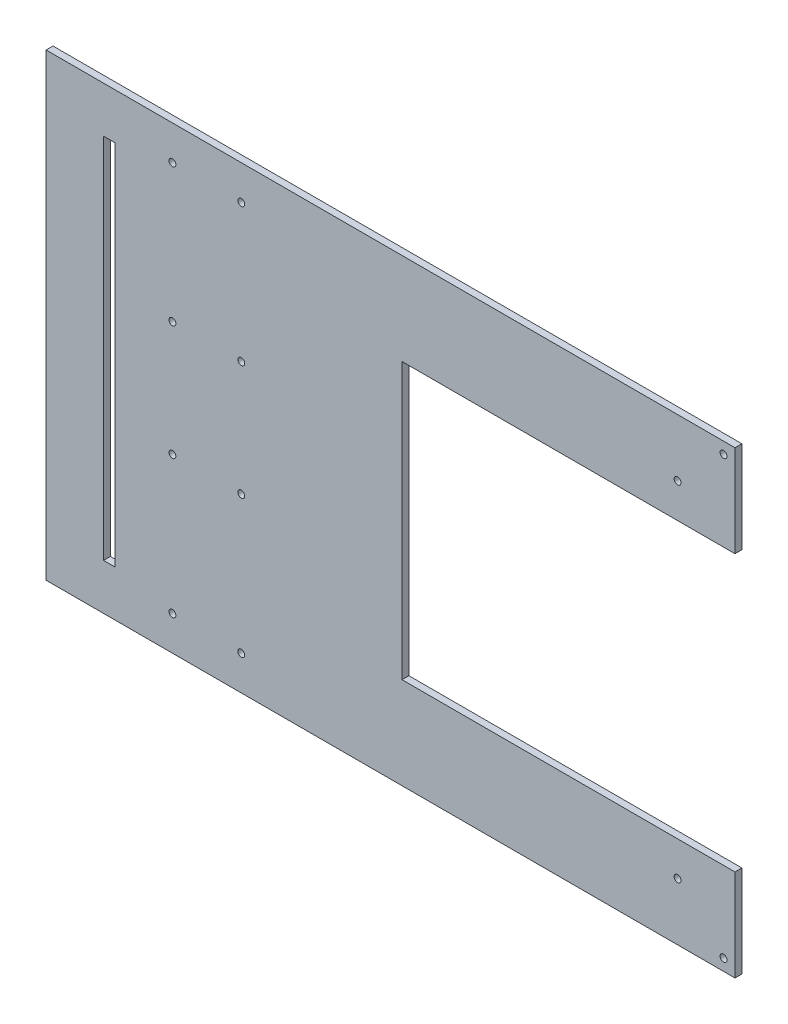
ISO-10303-21;
HEADER;
FILE_DESCRIPTION(('STEP AP214'),'2;1');
FILE_NAME('part.step','',(''),(''),'','','');
FILE_SCHEMA(('AUTOMOTIVE_DESIGN { 1 0 10303 214 1 1 1 1 }'));
ENDSEC;
DATA;
#1=APPLICATION_CONTEXT('core data for automotive mechanical design processes');
#2=APPLICATION_PROTOCOL_DEFINITION('international standard','automotive_design',2000,#1);
#3=PRODUCT_CONTEXT('',#1,'mechanical');
#4=PRODUCT('Part','Part','',(#3));
#5=PRODUCT_RELATED_PRODUCT_CATEGORY('part','',(#4));
#6=PRODUCT_DEFINITION_FORMATION('','',#4);
#7=PRODUCT_DEFINITION_CONTEXT('part definition',#1,'design');
#8=PRODUCT_DEFINITION('design','',#6,#7);
#9=PRODUCT_DEFINITION_SHAPE('','',#8);
#10=(LENGTH_UNIT() NAMED_UNIT(*) SI_UNIT(.MILLI.,.METRE.));
#11=(NAMED_UNIT(*) PLANE_ANGLE_UNIT() SI_UNIT($,.RADIAN.));
#12=(NAMED_UNIT(*) SI_UNIT($,.STERADIAN.) SOLID_ANGLE_UNIT());
#13=UNCERTAINTY_MEASURE_WITH_UNIT(LENGTH_MEASURE(1.E-05),#10,'distance_accuracy_value','');
#14=(GEOMETRIC_REPRESENTATION_CONTEXT(3) GLOBAL_UNCERTAINTY_ASSIGNED_CONTEXT((#13)) GLOBAL_UNIT_ASSIGNED_CONTEXT((#10,
#11,#12)) REPRESENTATION_CONTEXT('',''));
#15=CARTESIAN_POINT('',(0.,0.,0.));
#16=DIRECTION('',(0.,0.,1.));
#17=DIRECTION('',(1.,0.,0.));
#18=AXIS2_PLACEMENT_3D('',#15,#16,#17);
#19=CARTESIAN_POINT('',(0.,0.,3.));
#20=DIRECTION('',(0.,0.,-1.));
#21=DIRECTION('',(-1.,0.,0.));
#22=AXIS2_PLACEMENT_3D('',#19,#20,#21);
#23=PLANE('',#22);
#24=CARTESIAN_POINT('',(85.,75.,3.00000000000006));
#25=DIRECTION('',(0.,0.,-1.));
#26=DIRECTION('',(-1.,0.,0.));
#27=AXIS2_PLACEMENT_3D('',#24,#25,#26);
#28=CIRCLE('',#27,1.5);
#29=CARTESIAN_POINT('',(83.5,75.,3.00000000000006));
#30=VERTEX_POINT('',#29);
#31=EDGE_CURVE('E496',#30,#30,#28,.T.);
#32=ORIENTED_EDGE('',*,*,#31,.T.);
#33=EDGE_LOOP('',(#32));
#34=FACE_BOUND('',#33,.T.);
#35=CARTESIAN_POINT('',(55.,75.,3.00000000000006));
#36=DIRECTION('',(0.,0.,-1.));
#37=DIRECTION('',(-1.,0.,0.));
#38=AXIS2_PLACEMENT_3D('',#35,#36,#37);
#39=CIRCLE('',#38,1.5);
#40=CARTESIAN_POINT('',(53.5,75.,3.00000000000006));
#41=VERTEX_POINT('',#40);
#42=EDGE_CURVE('E490',#41,#41,#39,.T.);
#43=ORIENTED_EDGE('',*,*,#42,.T.);
#44=EDGE_LOOP('',(#43));
#45=FACE_BOUND('',#44,.T.);
#46=CARTESIAN_POINT('',(55.,15.,3.00000000000006));
#47=DIRECTION('',(0.,0.,-1.));
#48=DIRECTION('',(-1.,0.,0.));
#49=AXIS2_PLACEMENT_3D('',#46,#47,#48);
#50=CIRCLE('',#49,1.5);
#51=CARTESIAN_POINT('',(53.5,15.,3.00000000000006));
#52=VERTEX_POINT('',#51);
#53=EDGE_CURVE('E484',#52,#52,#50,.T.);
#54=ORIENTED_EDGE('',*,*,#53,.T.);
#55=EDGE_LOOP('',(#54));
#56=FACE_BOUND('',#55,.T.);
#57=CARTESIAN_POINT('',(85.,15.,3.00000000000006));
#58=DIRECTION('',(0.,0.,-1.));
#59=DIRECTION('',(-1.,0.,0.));
#60=AXIS2_PLACEMENT_3D('',#57,#58,#59);
#61=CIRCLE('',#60,1.5);
#62=CARTESIAN_POINT('',(83.5,15.,3.00000000000006));
#63=VERTEX_POINT('',#62);
#64=EDGE_CURVE('E478',#63,#63,#61,.T.);
#65=ORIENTED_EDGE('',*,*,#64,.T.);
#66=EDGE_LOOP('',(#65));
#67=FACE_BOUND('',#66,.T.);
#68=CARTESIAN_POINT('',(295.,5.,3.00000000000006));
#69=DIRECTION('',(0.,0.,-1.));
#70=DIRECTION('',(-1.,0.,0.));
#71=AXIS2_PLACEMENT_3D('',#68,#69,#70);
#72=CIRCLE('',#71,1.5);
#73=CARTESIAN_POINT('',(293.5,5.,3.00000000000006));
#74=VERTEX_POINT('',#73);
#75=EDGE_CURVE('E472',#74,#74,#72,.T.);
#76=ORIENTED_EDGE('',*,*,#75,.T.);
#77=EDGE_LOOP('',(#76));
#78=FACE_BOUND('',#77,.T.);
#79=CARTESIAN_POINT('',(275.,25.,3.00000000000006));
#80=DIRECTION('',(0.,0.,-1.));
#81=DIRECTION('',(-1.,0.,0.));
#82=AXIS2_PLACEMENT_3D('',#79,#80,#81);
#83=CIRCLE('',#82,1.5);
#84=CARTESIAN_POINT('',(273.5,25.,3.00000000000006));
#85=VERTEX_POINT('',#84);
#86=EDGE_CURVE('E466',#85,#85,#83,.T.);
#87=ORIENTED_EDGE('',*,*,#86,.T.);
#88=EDGE_LOOP('',(#87));
#89=FACE_BOUND('',#88,.T.);
#90=CARTESIAN_POINT('',(85.,185.,3.00000000000006));
#91=DIRECTION('',(0.,0.,-1.));
#92=DIRECTION('',(-1.,0.,0.));
#93=AXIS2_PLACEMENT_3D('',#90,#91,#92);
#94=CIRCLE('',#93,1.5);
#95=CARTESIAN_POINT('',(83.5,185.,3.00000000000006));
#96=VERTEX_POINT('',#95);
#97=EDGE_CURVE('E460',#96,#96,#94,.T.);
#98=ORIENTED_EDGE('',*,*,#97,.T.);
#99=EDGE_LOOP('',(#98));
#100=FACE_BOUND('',#99,.T.);
#101=CARTESIAN_POINT('',(55.,185.,3.00000000000006));
#102=DIRECTION('',(0.,0.,-1.));
#103=DIRECTION('',(-1.,0.,0.));
#104=AXIS2_PLACEMENT_3D('',#101,#102,#103);
#105=CIRCLE('',#104,1.5);
#106=CARTESIAN_POINT('',(53.5,185.,3.00000000000006));
#107=VERTEX_POINT('',#106);
#108=EDGE_CURVE('E454',#107,#107,#105,.T.);
#109=ORIENTED_EDGE('',*,*,#108,.T.);
#110=EDGE_LOOP('',(#109));
#111=FACE_BOUND('',#110,.T.);
#112=CARTESIAN_POINT('',(55.,125.,3.00000000000006));
#113=DIRECTION('',(0.,0.,-1.));
#114=DIRECTION('',(-1.,0.,0.));
#115=AXIS2_PLACEMENT_3D('',#112,#113,#114);
#116=CIRCLE('',#115,1.5);
#117=CARTESIAN_POINT('',(53.5,125.,3.00000000000006));
#118=VERTEX_POINT('',#117);
#119=EDGE_CURVE('E448',#118,#118,#116,.T.);
#120=ORIENTED_EDGE('',*,*,#119,.T.);
#121=EDGE_LOOP('',(#120));
#122=FACE_BOUND('',#121,.T.);
#123=CARTESIAN_POINT('',(85.,125.,3.00000000000006));
#124=DIRECTION('',(0.,0.,-1.));
#125=DIRECTION('',(-1.,0.,0.));
#126=AXIS2_PLACEMENT_3D('',#123,#124,#125);
#127=CIRCLE('',#126,1.5);
#128=CARTESIAN_POINT('',(83.5,125.,3.00000000000006));
#129=VERTEX_POINT('',#128);
#130=EDGE_CURVE('E442',#129,#129,#127,.T.);
#131=ORIENTED_EDGE('',*,*,#130,.T.);
#132=EDGE_LOOP('',(#131));
#133=FACE_BOUND('',#132,.T.);
#134=CARTESIAN_POINT('',(275.,175.,3.00000000000006));
#135=DIRECTION('',(0.,0.,-1.));
#136=DIRECTION('',(-1.,0.,0.));
#137=AXIS2_PLACEMENT_3D('',#134,#135,#136);
#138=CIRCLE('',#137,1.5);
#139=CARTESIAN_POINT('',(273.5,175.,3.00000000000006));
#140=VERTEX_POINT('',#139);
#141=EDGE_CURVE('E436',#140,#140,#138,.T.);
#142=ORIENTED_EDGE('',*,*,#141,.T.);
#143=EDGE_LOOP('',(#142));
#144=FACE_BOUND('',#143,.T.);
#145=CARTESIAN_POINT('',(295.,195.,3.00000000000006));
#146=DIRECTION('',(0.,0.,-1.));
#147=DIRECTION('',(-1.,0.,0.));
#148=AXIS2_PLACEMENT_3D('',#145,#146,#147);
#149=CIRCLE('',#148,1.5);
#150=CARTESIAN_POINT('',(293.5,195.,3.00000000000006));
#151=VERTEX_POINT('',#150);
#152=EDGE_CURVE('E144',#151,#151,#149,.T.);
#153=ORIENTED_EDGE('',*,*,#152,.T.);
#154=EDGE_LOOP('',(#153));
#155=FACE_BOUND('',#154,.T.);
#156=DIRECTION('',(1.,0.,0.));
#157=VECTOR('',#156,1.);
#158=CARTESIAN_POINT('',(300.,160.,3.));
#159=LINE('',#158,#157);
#160=CARTESIAN_POINT('',(155.,160.,3.));
#161=VERTEX_POINT('',#160);
#162=CARTESIAN_POINT('',(300.,160.,3.));
#163=VERTEX_POINT('',#162);
#164=EDGE_CURVE('E159',#161,#163,#159,.T.);
#165=ORIENTED_EDGE('',*,*,#164,.T.);
#166=DIRECTION('',(0.,1.,0.));
#167=VECTOR('',#166,1.);
#168=CARTESIAN_POINT('',(300.,0.,3.));
#169=LINE('',#168,#167);
#170=CARTESIAN_POINT('',(300.,200.,3.));
#171=VERTEX_POINT('',#170);
#172=EDGE_CURVE('E190',#163,#171,#169,.T.);
#173=ORIENTED_EDGE('',*,*,#172,.T.);
#174=DIRECTION('',(-1.,0.,0.));
#175=VECTOR('',#174,1.);
#176=CARTESIAN_POINT('',(0.,200.,3.));
#177=LINE('',#176,#175);
#178=CARTESIAN_POINT('',(0.,200.,3.));
#179=VERTEX_POINT('',#178);
#180=EDGE_CURVE('E194',#171,#179,#177,.T.);
#181=ORIENTED_EDGE('',*,*,#180,.T.);
#182=DIRECTION('',(0.,-1.,0.));
#183=VECTOR('',#182,1.);
#184=CARTESIAN_POINT('',(0.,0.,3.));
#185=LINE('',#184,#183);
#186=CARTESIAN_POINT('',(0.,0.,3.));
#187=VERTEX_POINT('',#186);
#188=EDGE_CURVE('E184',#179,#187,#185,.T.);
#189=ORIENTED_EDGE('',*,*,#188,.T.);
#190=DIRECTION('',(1.,0.,0.));
#191=VECTOR('',#190,1.);
#192=CARTESIAN_POINT('',(0.,0.,3.));
#193=LINE('',#192,#191);
#194=CARTESIAN_POINT('',(300.,0.,3.));
#195=VERTEX_POINT('',#194);
#196=EDGE_CURVE('E187',#187,#195,#193,.T.);
#197=ORIENTED_EDGE('',*,*,#196,.T.);
#198=CARTESIAN_POINT('',(300.,40.,3.));
#199=VERTEX_POINT('',#198);
#200=EDGE_CURVE('E191',#195,#199,#169,.T.);
#201=ORIENTED_EDGE('',*,*,#200,.T.);
#202=DIRECTION('',(1.,0.,0.));
#203=VECTOR('',#202,1.);
#204=CARTESIAN_POINT('',(300.,40.,3.));
#205=LINE('',#204,#203);
#206=CARTESIAN_POINT('',(155.,40.,3.00000000000006));
#207=VERTEX_POINT('',#206);
#208=EDGE_CURVE('E163',#207,#199,#205,.T.);
#209=ORIENTED_EDGE('',*,*,#208,.F.);
#210=DIRECTION('',(0.,1.,0.));
#211=VECTOR('',#210,1.);
#212=CARTESIAN_POINT('',(155.,160.,3.));
#213=LINE('',#212,#211);
#214=EDGE_CURVE('E156',#207,#161,#213,.T.);
#215=ORIENTED_EDGE('',*,*,#214,.T.);
#216=EDGE_LOOP('',(#165,#173,#181,#189,#197,#201,#209,#215));
#217=FACE_BOUND('',#216,.T.);
#218=DIRECTION('',(1.,0.,0.));
#219=VECTOR('',#218,1.);
#220=CARTESIAN_POINT('',(25.,180.,3.));
#221=LINE('',#220,#219);
#222=CARTESIAN_POINT('',(25.,180.,3.));
#223=VERTEX_POINT('',#222);
#224=CARTESIAN_POINT('',(30.,180.,3.));
#225=VERTEX_POINT('',#224);
#226=EDGE_CURVE('E152',#223,#225,#221,.T.);
#227=ORIENTED_EDGE('',*,*,#226,.T.);
#228=DIRECTION('',(0.,-1.,0.));
#229=VECTOR('',#228,1.);
#230=CARTESIAN_POINT('',(30.,180.,3.));
#231=LINE('',#230,#229);
#232=CARTESIAN_POINT('',(30.,20.,3.));
#233=VERTEX_POINT('',#232);
#234=EDGE_CURVE('E155',#225,#233,#231,.T.);
#235=ORIENTED_EDGE('',*,*,#234,.T.);
#236=DIRECTION('',(-1.,0.,0.));
#237=VECTOR('',#236,1.);
#238=CARTESIAN_POINT('',(25.,20.,3.));
#239=LINE('',#238,#237);
#240=CARTESIAN_POINT('',(25.,20.,3.));
#241=VERTEX_POINT('',#240);
#242=EDGE_CURVE('E125',#233,#241,#239,.T.);
#243=ORIENTED_EDGE('',*,*,#242,.T.);
#244=DIRECTION('',(0.,1.,0.));
#245=VECTOR('',#244,1.);
#246=CARTESIAN_POINT('',(25.,180.,3.));
#247=LINE('',#246,#245);
#248=EDGE_CURVE('E168',#241,#223,#247,.T.);
#249=ORIENTED_EDGE('',*,*,#248,.T.);
#250=EDGE_LOOP('',(#227,#235,#243,#249));
#251=FACE_BOUND('',#250,.T.);
#252=ADVANCED_FACE('F33',(#34,#45,#56,#67,#78,#89,#100,#111,#122,#133,#144,#155,#217,#251),#23,.F.);
#253=CARTESIAN_POINT('',(0.,0.,0.));
#254=DIRECTION('',(0.,0.,-1.));
#255=DIRECTION('',(-1.,0.,0.));
#256=AXIS2_PLACEMENT_3D('',#253,#254,#255);
#257=PLANE('',#256);
#258=CARTESIAN_POINT('',(85.,75.,0.));
#259=DIRECTION('',(0.,0.,-1.));
#260=DIRECTION('',(-1.,0.,0.));
#261=AXIS2_PLACEMENT_3D('',#258,#259,#260);
#262=CIRCLE('',#261,1.5);
#263=CARTESIAN_POINT('',(83.5,75.,0.));
#264=VERTEX_POINT('',#263);
#265=EDGE_CURVE('E498',#264,#264,#262,.T.);
#266=ORIENTED_EDGE('',*,*,#265,.F.);
#267=EDGE_LOOP('',(#266));
#268=FACE_BOUND('',#267,.T.);
#269=CARTESIAN_POINT('',(55.,75.,0.));
#270=DIRECTION('',(0.,0.,-1.));
#271=DIRECTION('',(-1.,0.,0.));
#272=AXIS2_PLACEMENT_3D('',#269,#270,#271);
#273=CIRCLE('',#272,1.5);
#274=CARTESIAN_POINT('',(53.5,75.,0.));
#275=VERTEX_POINT('',#274);
#276=EDGE_CURVE('E493',#275,#275,#273,.T.);
#277=ORIENTED_EDGE('',*,*,#276,.F.);
#278=EDGE_LOOP('',(#277));
#279=FACE_BOUND('',#278,.T.);
#280=CARTESIAN_POINT('',(55.,15.,0.));
#281=DIRECTION('',(0.,0.,-1.));
#282=DIRECTION('',(-1.,0.,0.));
#283=AXIS2_PLACEMENT_3D('',#280,#281,#282);
#284=CIRCLE('',#283,1.5);
#285=CARTESIAN_POINT('',(53.5,15.,0.));
#286=VERTEX_POINT('',#285);
#287=EDGE_CURVE('E487',#286,#286,#284,.T.);
#288=ORIENTED_EDGE('',*,*,#287,.F.);
#289=EDGE_LOOP('',(#288));
#290=FACE_BOUND('',#289,.T.);
#291=CARTESIAN_POINT('',(85.,15.,0.));
#292=DIRECTION('',(0.,0.,-1.));
#293=DIRECTION('',(-1.,0.,0.));
#294=AXIS2_PLACEMENT_3D('',#291,#292,#293);
#295=CIRCLE('',#294,1.5);
#296=CARTESIAN_POINT('',(83.5,15.,0.));
#297=VERTEX_POINT('',#296);
#298=EDGE_CURVE('E481',#297,#297,#295,.T.);
#299=ORIENTED_EDGE('',*,*,#298,.F.);
#300=EDGE_LOOP('',(#299));
#301=FACE_BOUND('',#300,.T.);
#302=CARTESIAN_POINT('',(295.,5.,0.));
#303=DIRECTION('',(0.,0.,-1.));
#304=DIRECTION('',(-1.,0.,0.));
#305=AXIS2_PLACEMENT_3D('',#302,#303,#304);
#306=CIRCLE('',#305,1.5);
#307=CARTESIAN_POINT('',(293.5,5.,0.));
#308=VERTEX_POINT('',#307);
#309=EDGE_CURVE('E475',#308,#308,#306,.T.);
#310=ORIENTED_EDGE('',*,*,#309,.F.);
#311=EDGE_LOOP('',(#310));
#312=FACE_BOUND('',#311,.T.);
#313=CARTESIAN_POINT('',(275.,25.,0.));
#314=DIRECTION('',(0.,0.,-1.));
#315=DIRECTION('',(-1.,0.,0.));
#316=AXIS2_PLACEMENT_3D('',#313,#314,#315);
#317=CIRCLE('',#316,1.5);
#318=CARTESIAN_POINT('',(273.5,25.,0.));
#319=VERTEX_POINT('',#318);
#320=EDGE_CURVE('E469',#319,#319,#317,.T.);
#321=ORIENTED_EDGE('',*,*,#320,.F.);
#322=EDGE_LOOP('',(#321));
#323=FACE_BOUND('',#322,.T.);
#324=CARTESIAN_POINT('',(85.,185.,0.));
#325=DIRECTION('',(0.,0.,-1.));
#326=DIRECTION('',(-1.,0.,0.));
#327=AXIS2_PLACEMENT_3D('',#324,#325,#326);
#328=CIRCLE('',#327,1.5);
#329=CARTESIAN_POINT('',(83.5,185.,0.));
#330=VERTEX_POINT('',#329);
#331=EDGE_CURVE('E463',#330,#330,#328,.T.);
#332=ORIENTED_EDGE('',*,*,#331,.F.);
#333=EDGE_LOOP('',(#332));
#334=FACE_BOUND('',#333,.T.);
#335=CARTESIAN_POINT('',(55.,185.,0.));
#336=DIRECTION('',(0.,0.,-1.));
#337=DIRECTION('',(-1.,0.,0.));
#338=AXIS2_PLACEMENT_3D('',#335,#336,#337);
#339=CIRCLE('',#338,1.5);
#340=CARTESIAN_POINT('',(53.5,185.,0.));
#341=VERTEX_POINT('',#340);
#342=EDGE_CURVE('E457',#341,#341,#339,.T.);
#343=ORIENTED_EDGE('',*,*,#342,.F.);
#344=EDGE_LOOP('',(#343));
#345=FACE_BOUND('',#344,.T.);
#346=CARTESIAN_POINT('',(55.,125.,0.));
#347=DIRECTION('',(0.,0.,-1.));
#348=DIRECTION('',(-1.,0.,0.));
#349=AXIS2_PLACEMENT_3D('',#346,#347,#348);
#350=CIRCLE('',#349,1.5);
#351=CARTESIAN_POINT('',(53.5,125.,0.));
#352=VERTEX_POINT('',#351);
#353=EDGE_CURVE('E451',#352,#352,#350,.T.);
#354=ORIENTED_EDGE('',*,*,#353,.F.);
#355=EDGE_LOOP('',(#354));
#356=FACE_BOUND('',#355,.T.);
#357=CARTESIAN_POINT('',(85.,125.,0.));
#358=DIRECTION('',(0.,0.,-1.));
#359=DIRECTION('',(-1.,0.,0.));
#360=AXIS2_PLACEMENT_3D('',#357,#358,#359);
#361=CIRCLE('',#360,1.5);
#362=CARTESIAN_POINT('',(83.5,125.,0.));
#363=VERTEX_POINT('',#362);
#364=EDGE_CURVE('E445',#363,#363,#361,.T.);
#365=ORIENTED_EDGE('',*,*,#364,.F.);
#366=EDGE_LOOP('',(#365));
#367=FACE_BOUND('',#366,.T.);
#368=CARTESIAN_POINT('',(275.,175.,0.));
#369=DIRECTION('',(0.,0.,-1.));
#370=DIRECTION('',(-1.,0.,0.));
#371=AXIS2_PLACEMENT_3D('',#368,#369,#370);
#372=CIRCLE('',#371,1.5);
#373=CARTESIAN_POINT('',(273.5,175.,0.));
#374=VERTEX_POINT('',#373);
#375=EDGE_CURVE('E439',#374,#374,#372,.T.);
#376=ORIENTED_EDGE('',*,*,#375,.F.);
#377=EDGE_LOOP('',(#376));
#378=FACE_BOUND('',#377,.T.);
#379=CARTESIAN_POINT('',(295.,195.,0.));
#380=DIRECTION('',(0.,0.,-1.));
#381=DIRECTION('',(-1.,0.,0.));
#382=AXIS2_PLACEMENT_3D('',#379,#380,#381);
#383=CIRCLE('',#382,1.5);
#384=CARTESIAN_POINT('',(293.5,195.,0.));
#385=VERTEX_POINT('',#384);
#386=EDGE_CURVE('E433',#385,#385,#383,.T.);
#387=ORIENTED_EDGE('',*,*,#386,.F.);
#388=EDGE_LOOP('',(#387));
#389=FACE_BOUND('',#388,.T.);
#390=DIRECTION('',(0.,1.,0.));
#391=VECTOR('',#390,1.);
#392=CARTESIAN_POINT('',(300.,0.,0.));
#393=LINE('',#392,#391);
#394=CARTESIAN_POINT('',(300.,160.,0.));
#395=VERTEX_POINT('',#394);
#396=CARTESIAN_POINT('',(300.,200.,0.));
#397=VERTEX_POINT('',#396);
#398=EDGE_CURVE('E201',#395,#397,#393,.T.);
#399=ORIENTED_EDGE('',*,*,#398,.F.);
#400=DIRECTION('',(-1.,0.,0.));
#401=VECTOR('',#400,1.);
#402=CARTESIAN_POINT('',(300.,160.,0.));
#403=LINE('',#402,#401);
#404=CARTESIAN_POINT('',(155.,160.,0.));
#405=VERTEX_POINT('',#404);
#406=EDGE_CURVE('E171',#395,#405,#403,.T.);
#407=ORIENTED_EDGE('',*,*,#406,.T.);
#408=DIRECTION('',(0.,-1.,0.));
#409=VECTOR('',#408,1.);
#410=CARTESIAN_POINT('',(155.,160.,0.));
#411=LINE('',#410,#409);
#412=CARTESIAN_POINT('',(155.,40.,0.));
#413=VERTEX_POINT('',#412);
#414=EDGE_CURVE('E167',#405,#413,#411,.T.);
#415=ORIENTED_EDGE('',*,*,#414,.T.);
#416=DIRECTION('',(-1.,0.,0.));
#417=VECTOR('',#416,1.);
#418=CARTESIAN_POINT('',(300.,40.,0.));
#419=LINE('',#418,#417);
#420=CARTESIAN_POINT('',(300.,40.,0.));
#421=VERTEX_POINT('',#420);
#422=EDGE_CURVE('E164',#421,#413,#419,.T.);
#423=ORIENTED_EDGE('',*,*,#422,.F.);
#424=CARTESIAN_POINT('',(300.,0.,0.));
#425=VERTEX_POINT('',#424);
#426=EDGE_CURVE('E202',#425,#421,#393,.T.);
#427=ORIENTED_EDGE('',*,*,#426,.F.);
#428=DIRECTION('',(1.,0.,0.));
#429=VECTOR('',#428,1.);
#430=CARTESIAN_POINT('',(0.,0.,0.));
#431=LINE('',#430,#429);
#432=CARTESIAN_POINT('',(0.,0.,0.));
#433=VERTEX_POINT('',#432);
#434=EDGE_CURVE('E199',#433,#425,#431,.T.);
#435=ORIENTED_EDGE('',*,*,#434,.F.);
#436=DIRECTION('',(0.,-1.,0.));
#437=VECTOR('',#436,1.);
#438=CARTESIAN_POINT('',(0.,0.,0.));
#439=LINE('',#438,#437);
#440=CARTESIAN_POINT('',(0.,200.,0.));
#441=VERTEX_POINT('',#440);
#442=EDGE_CURVE('E183',#441,#433,#439,.T.);
#443=ORIENTED_EDGE('',*,*,#442,.F.);
#444=DIRECTION('',(-1.,0.,0.));
#445=VECTOR('',#444,1.);
#446=CARTESIAN_POINT('',(0.,200.,0.));
#447=LINE('',#446,#445);
#448=EDGE_CURVE('E188',#397,#441,#447,.T.);
#449=ORIENTED_EDGE('',*,*,#448,.F.);
#450=EDGE_LOOP('',(#399,#407,#415,#423,#427,#435,#443,#449));
#451=FACE_BOUND('',#450,.T.);
#452=DIRECTION('',(0.,1.,0.));
#453=VECTOR('',#452,1.);
#454=CARTESIAN_POINT('',(30.,180.,0.));
#455=LINE('',#454,#453);
#456=CARTESIAN_POINT('',(30.,20.,0.));
#457=VERTEX_POINT('',#456);
#458=CARTESIAN_POINT('',(30.,180.,0.));
#459=VERTEX_POINT('',#458);
#460=EDGE_CURVE('E132',#457,#459,#455,.T.);
#461=ORIENTED_EDGE('',*,*,#460,.T.);
#462=DIRECTION('',(-1.,0.,0.));
#463=VECTOR('',#462,1.);
#464=CARTESIAN_POINT('',(25.,180.,0.));
#465=LINE('',#464,#463);
#466=CARTESIAN_POINT('',(25.,180.,0.));
#467=VERTEX_POINT('',#466);
#468=EDGE_CURVE('E138',#459,#467,#465,.T.);
#469=ORIENTED_EDGE('',*,*,#468,.T.);
#470=DIRECTION('',(0.,-1.,0.));
#471=VECTOR('',#470,1.);
#472=CARTESIAN_POINT('',(25.,180.,0.));
#473=LINE('',#472,#471);
#474=CARTESIAN_POINT('',(25.,20.,0.));
#475=VERTEX_POINT('',#474);
#476=EDGE_CURVE('E142',#467,#475,#473,.T.);
#477=ORIENTED_EDGE('',*,*,#476,.T.);
#478=DIRECTION('',(1.,0.,0.));
#479=VECTOR('',#478,1.);
#480=CARTESIAN_POINT('',(25.,20.,0.));
#481=LINE('',#480,#479);
#482=EDGE_CURVE('E56',#475,#457,#481,.T.);
#483=ORIENTED_EDGE('',*,*,#482,.T.);
#484=EDGE_LOOP('',(#461,#469,#477,#483));
#485=FACE_BOUND('',#484,.T.);
#486=ADVANCED_FACE('F141',(#268,#279,#290,#301,#312,#323,#334,#345,#356,#367,#378,#389,#451,
#485),#257,.T.);
#487=CARTESIAN_POINT('',(300.,0.,3.));
#488=DIRECTION('',(-1.,0.,0.));
#489=DIRECTION('',(0.,0.,1.));
#490=AXIS2_PLACEMENT_3D('',#487,#488,#489);
#491=PLANE('',#490);
#492=DIRECTION('',(0.,0.,-1.));
#493=VECTOR('',#492,1.);
#494=CARTESIAN_POINT('',(300.,160.,191.215302247187));
#495=LINE('',#494,#493);
#496=EDGE_CURVE('E160',#163,#395,#495,.T.);
#497=ORIENTED_EDGE('',*,*,#496,.T.);
#498=ORIENTED_EDGE('',*,*,#398,.T.);
#499=DIRECTION('',(0.,0.,-1.));
#500=VECTOR('',#499,1.);
#501=CARTESIAN_POINT('',(300.,200.,3.));
#502=LINE('',#501,#500);
#503=EDGE_CURVE('E208',#171,#397,#502,.T.);
#504=ORIENTED_EDGE('',*,*,#503,.F.);
#505=ORIENTED_EDGE('',*,*,#172,.F.);
#506=EDGE_LOOP('',(#497,#498,#504,#505));
#507=FACE_BOUND('',#506,.T.);
#508=ADVANCED_FACE('F241',(#507),#491,.F.);
#509=CARTESIAN_POINT('',(0.,0.,3.));
#510=DIRECTION('',(1.,0.,0.));
#511=DIRECTION('',(0.,0.,-1.));
#512=AXIS2_PLACEMENT_3D('',#509,#510,#511);
#513=PLANE('',#512);
#514=ORIENTED_EDGE('',*,*,#442,.T.);
#515=DIRECTION('',(0.,0.,-1.));
#516=VECTOR('',#515,1.);
#517=CARTESIAN_POINT('',(0.,0.,3.));
#518=LINE('',#517,#516);
#519=EDGE_CURVE('E11',#187,#433,#518,.T.);
#520=ORIENTED_EDGE('',*,*,#519,.F.);
#521=ORIENTED_EDGE('',*,*,#188,.F.);
#522=DIRECTION('',(0.,0.,-1.));
#523=VECTOR('',#522,1.);
#524=CARTESIAN_POINT('',(0.,200.,3.));
#525=LINE('',#524,#523);
#526=EDGE_CURVE('E196',#179,#441,#525,.T.);
#527=ORIENTED_EDGE('',*,*,#526,.T.);
#528=EDGE_LOOP('',(#514,#520,#521,#527));
#529=FACE_BOUND('',#528,.T.);
#530=ADVANCED_FACE('F35',(#529),#513,.F.);
#531=CARTESIAN_POINT('',(0.,0.,3.));
#532=DIRECTION('',(0.,1.,0.));
#533=DIRECTION('',(0.,0.,1.));
#534=AXIS2_PLACEMENT_3D('',#531,#532,#533);
#535=PLANE('',#534);
#536=ORIENTED_EDGE('',*,*,#434,.T.);
#537=DIRECTION('',(0.,0.,-1.));
#538=VECTOR('',#537,1.);
#539=CARTESIAN_POINT('',(300.,0.,3.));
#540=LINE('',#539,#538);
#541=EDGE_CURVE('E41',#195,#425,#540,.T.);
#542=ORIENTED_EDGE('',*,*,#541,.F.);
#543=ORIENTED_EDGE('',*,*,#196,.F.);
#544=ORIENTED_EDGE('',*,*,#519,.T.);
#545=EDGE_LOOP('',(#536,#542,#543,#544));
#546=FACE_BOUND('',#545,.T.);
#547=ADVANCED_FACE('F231',(#546),#535,.F.);
#548=ORIENTED_EDGE('',*,*,#426,.T.);
#549=DIRECTION('',(0.,0.,-1.));
#550=VECTOR('',#549,1.);
#551=CARTESIAN_POINT('',(300.,40.,191.215302247187));
#552=LINE('',#551,#550);
#553=EDGE_CURVE('E174',#199,#421,#552,.T.);
#554=ORIENTED_EDGE('',*,*,#553,.F.);
#555=ORIENTED_EDGE('',*,*,#200,.F.);
#556=ORIENTED_EDGE('',*,*,#541,.T.);
#557=EDGE_LOOP('',(#548,#554,#555,#556));
#558=FACE_BOUND('',#557,.T.);
#559=ADVANCED_FACE('F215',(#558),#491,.F.);
#560=CARTESIAN_POINT('',(0.,200.,3.));
#561=DIRECTION('',(0.,-1.,0.));
#562=DIRECTION('',(0.,0.,-1.));
#563=AXIS2_PLACEMENT_3D('',#560,#561,#562);
#564=PLANE('',#563);
#565=ORIENTED_EDGE('',*,*,#448,.T.);
#566=ORIENTED_EDGE('',*,*,#526,.F.);
#567=ORIENTED_EDGE('',*,*,#180,.F.);
#568=ORIENTED_EDGE('',*,*,#503,.T.);
#569=EDGE_LOOP('',(#565,#566,#567,#568));
#570=FACE_BOUND('',#569,.T.);
#571=ADVANCED_FACE('F236',(#570),#564,.F.);
#572=CARTESIAN_POINT('',(300.,160.,191.215302247187));
#573=DIRECTION('',(0.,-1.,0.));
#574=DIRECTION('',(1.,0.,0.));
#575=AXIS2_PLACEMENT_3D('',#572,#573,#574);
#576=PLANE('',#575);
#577=DIRECTION('',(0.,0.,-1.));
#578=VECTOR('',#577,1.);
#579=CARTESIAN_POINT('',(155.,160.,191.215302247187));
#580=LINE('',#579,#578);
#581=EDGE_CURVE('E177',#161,#405,#580,.T.);
#582=ORIENTED_EDGE('',*,*,#581,.T.);
#583=ORIENTED_EDGE('',*,*,#406,.F.);
#584=ORIENTED_EDGE('',*,*,#496,.F.);
#585=ORIENTED_EDGE('',*,*,#164,.F.);
#586=EDGE_LOOP('',(#582,#583,#584,#585));
#587=FACE_BOUND('',#586,.T.);
#588=ADVANCED_FACE('F243',(#587),#576,.T.);
#589=CARTESIAN_POINT('',(155.,160.,191.215302247187));
#590=DIRECTION('',(1.,0.,0.));
#591=DIRECTION('',(0.,1.,0.));
#592=AXIS2_PLACEMENT_3D('',#589,#590,#591);
#593=PLANE('',#592);
#594=DIRECTION('',(0.,0.,-1.));
#595=VECTOR('',#594,1.);
#596=CARTESIAN_POINT('',(155.,40.,191.215302247187));
#597=LINE('',#596,#595);
#598=EDGE_CURVE('E179',#207,#413,#597,.T.);
#599=ORIENTED_EDGE('',*,*,#598,.T.);
#600=ORIENTED_EDGE('',*,*,#414,.F.);
#601=ORIENTED_EDGE('',*,*,#581,.F.);
#602=ORIENTED_EDGE('',*,*,#214,.F.);
#603=EDGE_LOOP('',(#599,#600,#601,#602));
#604=FACE_BOUND('',#603,.T.);
#605=ADVANCED_FACE('F246',(#604),#593,.T.);
#606=CARTESIAN_POINT('',(300.,40.,191.215302247187));
#607=DIRECTION('',(0.,-1.,0.));
#608=DIRECTION('',(1.,0.,0.));
#609=AXIS2_PLACEMENT_3D('',#606,#607,#608);
#610=PLANE('',#609);
#611=ORIENTED_EDGE('',*,*,#208,.T.);
#612=ORIENTED_EDGE('',*,*,#553,.T.);
#613=ORIENTED_EDGE('',*,*,#422,.T.);
#614=ORIENTED_EDGE('',*,*,#598,.F.);
#615=EDGE_LOOP('',(#611,#612,#613,#614));
#616=FACE_BOUND('',#615,.T.);
#617=ADVANCED_FACE('F225',(#616),#610,.F.);
#618=CARTESIAN_POINT('',(25.,180.,163.078105935821));
#619=DIRECTION('',(0.,-1.,0.));
#620=DIRECTION('',(0.,0.,-1.));
#621=AXIS2_PLACEMENT_3D('',#618,#619,#620);
#622=PLANE('',#621);
#623=DIRECTION('',(0.,0.,-1.));
#624=VECTOR('',#623,1.);
#625=CARTESIAN_POINT('',(25.,180.,163.078105935821));
#626=LINE('',#625,#624);
#627=EDGE_CURVE('E48',#223,#467,#626,.T.);
#628=ORIENTED_EDGE('',*,*,#627,.T.);
#629=ORIENTED_EDGE('',*,*,#468,.F.);
#630=DIRECTION('',(0.,0.,-1.));
#631=VECTOR('',#630,1.);
#632=CARTESIAN_POINT('',(30.,180.,163.078105935821));
#633=LINE('',#632,#631);
#634=EDGE_CURVE('E129',#225,#459,#633,.T.);
#635=ORIENTED_EDGE('',*,*,#634,.F.);
#636=ORIENTED_EDGE('',*,*,#226,.F.);
#637=EDGE_LOOP('',(#628,#629,#635,#636));
#638=FACE_BOUND('',#637,.T.);
#639=ADVANCED_FACE('F253',(#638),#622,.T.);
#640=CARTESIAN_POINT('',(30.,180.,163.078105935821));
#641=DIRECTION('',(-1.,0.,0.));
#642=DIRECTION('',(0.,-1.,0.));
#643=AXIS2_PLACEMENT_3D('',#640,#641,#642);
#644=PLANE('',#643);
#645=ORIENTED_EDGE('',*,*,#634,.T.);
#646=ORIENTED_EDGE('',*,*,#460,.F.);
#647=DIRECTION('',(0.,0.,-1.));
#648=VECTOR('',#647,1.);
#649=CARTESIAN_POINT('',(30.,20.,163.078105935821));
#650=LINE('',#649,#648);
#651=EDGE_CURVE('E121',#233,#457,#650,.T.);
#652=ORIENTED_EDGE('',*,*,#651,.F.);
#653=ORIENTED_EDGE('',*,*,#234,.F.);
#654=EDGE_LOOP('',(#645,#646,#652,#653));
#655=FACE_BOUND('',#654,.T.);
#656=ADVANCED_FACE('F133',(#655),#644,.T.);
#657=CARTESIAN_POINT('',(25.,20.,163.078105935821));
#658=DIRECTION('',(0.,1.,0.));
#659=DIRECTION('',(-1.,0.,0.));
#660=AXIS2_PLACEMENT_3D('',#657,#658,#659);
#661=PLANE('',#660);
#662=ORIENTED_EDGE('',*,*,#651,.T.);
#663=ORIENTED_EDGE('',*,*,#482,.F.);
#664=DIRECTION('',(0.,0.,-1.));
#665=VECTOR('',#664,1.);
#666=CARTESIAN_POINT('',(25.,20.,163.078105935821));
#667=LINE('',#666,#665);
#668=EDGE_CURVE('E128',#241,#475,#667,.T.);
#669=ORIENTED_EDGE('',*,*,#668,.F.);
#670=ORIENTED_EDGE('',*,*,#242,.F.);
#671=EDGE_LOOP('',(#662,#663,#669,#670));
#672=FACE_BOUND('',#671,.T.);
#673=ADVANCED_FACE('F123',(#672),#661,.T.);
#674=CARTESIAN_POINT('',(25.,180.,163.078105935821));
#675=DIRECTION('',(1.,0.,0.));
#676=DIRECTION('',(0.,1.,0.));
#677=AXIS2_PLACEMENT_3D('',#674,#675,#676);
#678=PLANE('',#677);
#679=ORIENTED_EDGE('',*,*,#668,.T.);
#680=ORIENTED_EDGE('',*,*,#476,.F.);
#681=ORIENTED_EDGE('',*,*,#627,.F.);
#682=ORIENTED_EDGE('',*,*,#248,.F.);
#683=EDGE_LOOP('',(#679,#680,#681,#682));
#684=FACE_BOUND('',#683,.T.);
#685=ADVANCED_FACE('F300',(#684),#678,.T.);
#686=CARTESIAN_POINT('',(295.,195.,0.));
#687=DIRECTION('',(0.,0.,-1.));
#688=DIRECTION('',(-1.,0.,0.));
#689=AXIS2_PLACEMENT_3D('',#686,#687,#688);
#690=CYLINDRICAL_SURFACE('',#689,1.5);
#691=ORIENTED_EDGE('',*,*,#152,.F.);
#692=EDGE_LOOP('',(#691));
#693=FACE_BOUND('',#692,.T.);
#694=ORIENTED_EDGE('',*,*,#386,.T.);
#695=EDGE_LOOP('',(#694));
#696=FACE_BOUND('',#695,.T.);
#697=ADVANCED_FACE('F294',(#693,#696),#690,.F.);
#698=CARTESIAN_POINT('',(275.,175.,0.));
#699=DIRECTION('',(0.,0.,-1.));
#700=DIRECTION('',(-1.,0.,0.));
#701=AXIS2_PLACEMENT_3D('',#698,#699,#700);
#702=CYLINDRICAL_SURFACE('',#701,1.5);
#703=ORIENTED_EDGE('',*,*,#141,.F.);
#704=EDGE_LOOP('',(#703));
#705=FACE_BOUND('',#704,.T.);
#706=ORIENTED_EDGE('',*,*,#375,.T.);
#707=EDGE_LOOP('',(#706));
#708=FACE_BOUND('',#707,.T.);
#709=ADVANCED_FACE('F299',(#705,#708),#702,.F.);
#710=CARTESIAN_POINT('',(85.,125.,0.));
#711=DIRECTION('',(0.,0.,-1.));
#712=DIRECTION('',(-1.,0.,0.));
#713=AXIS2_PLACEMENT_3D('',#710,#711,#712);
#714=CYLINDRICAL_SURFACE('',#713,1.5);
#715=ORIENTED_EDGE('',*,*,#130,.F.);
#716=EDGE_LOOP('',(#715));
#717=FACE_BOUND('',#716,.T.);
#718=ORIENTED_EDGE('',*,*,#364,.T.);
#719=EDGE_LOOP('',(#718));
#720=FACE_BOUND('',#719,.T.);
#721=ADVANCED_FACE('F312',(#717,#720),#714,.F.);
#722=CARTESIAN_POINT('',(55.,125.,0.));
#723=DIRECTION('',(0.,0.,-1.));
#724=DIRECTION('',(-1.,0.,0.));
#725=AXIS2_PLACEMENT_3D('',#722,#723,#724);
#726=CYLINDRICAL_SURFACE('',#725,1.5);
#727=ORIENTED_EDGE('',*,*,#119,.F.);
#728=EDGE_LOOP('',(#727));
#729=FACE_BOUND('',#728,.T.);
#730=ORIENTED_EDGE('',*,*,#353,.T.);
#731=EDGE_LOOP('',(#730));
#732=FACE_BOUND('',#731,.T.);
#733=ADVANCED_FACE('F322',(#729,#732),#726,.F.);
#734=CARTESIAN_POINT('',(55.,185.,0.));
#735=DIRECTION('',(0.,0.,-1.));
#736=DIRECTION('',(-1.,0.,0.));
#737=AXIS2_PLACEMENT_3D('',#734,#735,#736);
#738=CYLINDRICAL_SURFACE('',#737,1.5);
#739=ORIENTED_EDGE('',*,*,#108,.F.);
#740=EDGE_LOOP('',(#739));
#741=FACE_BOUND('',#740,.T.);
#742=ORIENTED_EDGE('',*,*,#342,.T.);
#743=EDGE_LOOP('',(#742));
#744=FACE_BOUND('',#743,.T.);
#745=ADVANCED_FACE('F332',(#741,#744),#738,.F.);
#746=CARTESIAN_POINT('',(85.,185.,0.));
#747=DIRECTION('',(0.,0.,-1.));
#748=DIRECTION('',(-1.,0.,0.));
#749=AXIS2_PLACEMENT_3D('',#746,#747,#748);
#750=CYLINDRICAL_SURFACE('',#749,1.5);
#751=ORIENTED_EDGE('',*,*,#97,.F.);
#752=EDGE_LOOP('',(#751));
#753=FACE_BOUND('',#752,.T.);
#754=ORIENTED_EDGE('',*,*,#331,.T.);
#755=EDGE_LOOP('',(#754));
#756=FACE_BOUND('',#755,.T.);
#757=ADVANCED_FACE('F342',(#753,#756),#750,.F.);
#758=CARTESIAN_POINT('',(275.,25.,0.));
#759=DIRECTION('',(0.,0.,-1.));
#760=DIRECTION('',(-1.,0.,0.));
#761=AXIS2_PLACEMENT_3D('',#758,#759,#760);
#762=CYLINDRICAL_SURFACE('',#761,1.5);
#763=ORIENTED_EDGE('',*,*,#86,.F.);
#764=EDGE_LOOP('',(#763));
#765=FACE_BOUND('',#764,.T.);
#766=ORIENTED_EDGE('',*,*,#320,.T.);
#767=EDGE_LOOP('',(#766));
#768=FACE_BOUND('',#767,.T.);
#769=ADVANCED_FACE('F352',(#765,#768),#762,.F.);
#770=CARTESIAN_POINT('',(295.,5.,0.));
#771=DIRECTION('',(0.,0.,-1.));
#772=DIRECTION('',(-1.,0.,0.));
#773=AXIS2_PLACEMENT_3D('',#770,#771,#772);
#774=CYLINDRICAL_SURFACE('',#773,1.5);
#775=ORIENTED_EDGE('',*,*,#75,.F.);
#776=EDGE_LOOP('',(#775));
#777=FACE_BOUND('',#776,.T.);
#778=ORIENTED_EDGE('',*,*,#309,.T.);
#779=EDGE_LOOP('',(#778));
#780=FACE_BOUND('',#779,.T.);
#781=ADVANCED_FACE('F362',(#777,#780),#774,.F.);
#782=CARTESIAN_POINT('',(85.,15.,0.));
#783=DIRECTION('',(0.,0.,-1.));
#784=DIRECTION('',(-1.,0.,0.));
#785=AXIS2_PLACEMENT_3D('',#782,#783,#784);
#786=CYLINDRICAL_SURFACE('',#785,1.5);
#787=ORIENTED_EDGE('',*,*,#64,.F.);
#788=EDGE_LOOP('',(#787));
#789=FACE_BOUND('',#788,.T.);
#790=ORIENTED_EDGE('',*,*,#298,.T.);
#791=EDGE_LOOP('',(#790));
#792=FACE_BOUND('',#791,.T.);
#793=ADVANCED_FACE('F372',(#789,#792),#786,.F.);
#794=CARTESIAN_POINT('',(55.,15.,0.));
#795=DIRECTION('',(0.,0.,-1.));
#796=DIRECTION('',(-1.,0.,0.));
#797=AXIS2_PLACEMENT_3D('',#794,#795,#796);
#798=CYLINDRICAL_SURFACE('',#797,1.5);
#799=ORIENTED_EDGE('',*,*,#53,.F.);
#800=EDGE_LOOP('',(#799));
#801=FACE_BOUND('',#800,.T.);
#802=ORIENTED_EDGE('',*,*,#287,.T.);
#803=EDGE_LOOP('',(#802));
#804=FACE_BOUND('',#803,.T.);
#805=ADVANCED_FACE('F382',(#801,#804),#798,.F.);
#806=CARTESIAN_POINT('',(55.,75.,0.));
#807=DIRECTION('',(0.,0.,-1.));
#808=DIRECTION('',(-1.,0.,0.));
#809=AXIS2_PLACEMENT_3D('',#806,#807,#808);
#810=CYLINDRICAL_SURFACE('',#809,1.5);
#811=ORIENTED_EDGE('',*,*,#42,.F.);
#812=EDGE_LOOP('',(#811));
#813=FACE_BOUND('',#812,.T.);
#814=ORIENTED_EDGE('',*,*,#276,.T.);
#815=EDGE_LOOP('',(#814));
#816=FACE_BOUND('',#815,.T.);
#817=ADVANCED_FACE('F392',(#813,#816),#810,.F.);
#818=CARTESIAN_POINT('',(85.,75.,0.));
#819=DIRECTION('',(0.,0.,-1.));
#820=DIRECTION('',(-1.,0.,0.));
#821=AXIS2_PLACEMENT_3D('',#818,#819,#820);
#822=CYLINDRICAL_SURFACE('',#821,1.5);
#823=ORIENTED_EDGE('',*,*,#31,.F.);
#824=EDGE_LOOP('',(#823));
#825=FACE_BOUND('',#824,.T.);
#826=ORIENTED_EDGE('',*,*,#265,.T.);
#827=EDGE_LOOP('',(#826));
#828=FACE_BOUND('',#827,.T.);
#829=ADVANCED_FACE('F402',(#825,#828),#822,.F.);
#830=CLOSED_SHELL('',(#252,#486,#508,#530,#547,#559,#571,#588,#605,#617,#639,#656,#673,#685,
#697,#709,#721,#733,#745,#757,#769,#781,#793,#805,#817,#829));
#831=MANIFOLD_SOLID_BREP('B2',#830);
#832=ADVANCED_BREP_SHAPE_REPRESENTATION('',(#18,#831),#14);
#833=SHAPE_DEFINITION_REPRESENTATION(#9,#832);
ENDSEC;
END-ISO-10303-21;
